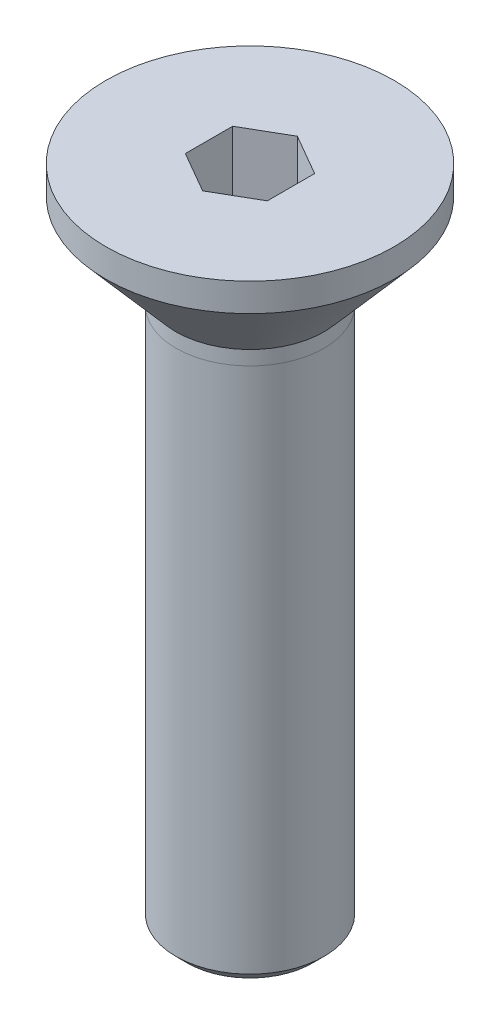
ISO-10303-21;
HEADER;
FILE_DESCRIPTION(('STEP AP214'),'2;1');
FILE_NAME('part.step','',(''),(''),'','','');
FILE_SCHEMA(('AUTOMOTIVE_DESIGN { 1 0 10303 214 1 1 1 1 }'));
ENDSEC;
DATA;
#1=APPLICATION_CONTEXT('core data for automotive mechanical design processes');
#2=APPLICATION_PROTOCOL_DEFINITION('international standard','automotive_design',2000,#1);
#3=PRODUCT_CONTEXT('',#1,'mechanical');
#4=PRODUCT('Part','Part','',(#3));
#5=PRODUCT_RELATED_PRODUCT_CATEGORY('part','',(#4));
#6=PRODUCT_DEFINITION_FORMATION('','',#4);
#7=PRODUCT_DEFINITION_CONTEXT('part definition',#1,'design');
#8=PRODUCT_DEFINITION('design','',#6,#7);
#9=PRODUCT_DEFINITION_SHAPE('','',#8);
#10=(LENGTH_UNIT() NAMED_UNIT(*) SI_UNIT(.MILLI.,.METRE.));
#11=(NAMED_UNIT(*) PLANE_ANGLE_UNIT() SI_UNIT($,.RADIAN.));
#12=(NAMED_UNIT(*) SI_UNIT($,.STERADIAN.) SOLID_ANGLE_UNIT());
#13=UNCERTAINTY_MEASURE_WITH_UNIT(LENGTH_MEASURE(1.E-05),#10,'distance_accuracy_value','');
#14=(GEOMETRIC_REPRESENTATION_CONTEXT(3) GLOBAL_UNCERTAINTY_ASSIGNED_CONTEXT((#13)) GLOBAL_UNIT_ASSIGNED_CONTEXT((#10,
#11,#12)) REPRESENTATION_CONTEXT('',''));
#15=CARTESIAN_POINT('',(0.,0.,0.));
#16=DIRECTION('',(0.,0.,1.));
#17=DIRECTION('',(1.,0.,0.));
#18=AXIS2_PLACEMENT_3D('',#15,#16,#17);
#19=CARTESIAN_POINT('',(0.,0.,0.));
#20=DIRECTION('',(0.,1.,0.));
#21=DIRECTION('',(0.,0.,1.));
#22=AXIS2_PLACEMENT_3D('',#19,#20,#21);
#23=CYLINDRICAL_SURFACE('',#22,1.42240000000001);
#24=CARTESIAN_POINT('',(0.,-2.08918406435412,0.));
#25=DIRECTION('',(0.,1.,0.));
#26=DIRECTION('',(0.,0.,1.));
#27=AXIS2_PLACEMENT_3D('',#24,#25,#26);
#28=CIRCLE('',#27,1.42240000000001);
#29=CARTESIAN_POINT('',(0.,-2.08918406435412,1.42240000000001));
#30=VERTEX_POINT('',#29);
#31=EDGE_CURVE('E148',#30,#30,#28,.T.);
#32=ORIENTED_EDGE('',*,*,#31,.F.);
#33=EDGE_LOOP('',(#32));
#34=FACE_BOUND('',#33,.T.);
#35=CARTESIAN_POINT('',(0.,-2.3622,0.));
#36=DIRECTION('',(0.,1.,0.));
#37=DIRECTION('',(0.,0.,1.));
#38=AXIS2_PLACEMENT_3D('',#35,#36,#37);
#39=CIRCLE('',#38,1.42240000000001);
#40=CARTESIAN_POINT('',(0.,-2.3622,1.42240000000001));
#41=VERTEX_POINT('',#40);
#42=EDGE_CURVE('E12',#41,#41,#39,.T.);
#43=ORIENTED_EDGE('',*,*,#42,.T.);
#44=EDGE_LOOP('',(#43));
#45=FACE_BOUND('',#44,.T.);
#46=ADVANCED_FACE('F35',(#34,#45),#23,.T.);
#47=CARTESIAN_POINT('',(0.,0.,0.));
#48=DIRECTION('',(0.,-1.,0.));
#49=DIRECTION('',(0.,0.,-1.));
#50=AXIS2_PLACEMENT_3D('',#47,#48,#49);
#51=PLANE('',#50);
#52=DIRECTION('',(-0.866025403784439,0.,0.5));
#53=VECTOR('',#52,1.);
#54=CARTESIAN_POINT('',(0.,0.,-0.909211203919823));
#55=LINE('',#54,#53);
#56=CARTESIAN_POINT('',(0.,0.,-0.909211203919823));
#57=VERTEX_POINT('',#56);
#58=CARTESIAN_POINT('',(-0.7874,0.,-0.454605601959912));
#59=VERTEX_POINT('',#58);
#60=EDGE_CURVE('E124',#57,#59,#55,.T.);
#61=ORIENTED_EDGE('',*,*,#60,.F.);
#62=DIRECTION('',(-0.866025403784438,0.,-0.5));
#63=VECTOR('',#62,1.);
#64=CARTESIAN_POINT('',(0.7874,0.,-0.454605601959911));
#65=LINE('',#64,#63);
#66=CARTESIAN_POINT('',(0.7874,0.,-0.454605601959911));
#67=VERTEX_POINT('',#66);
#68=EDGE_CURVE('E50',#67,#57,#65,.T.);
#69=ORIENTED_EDGE('',*,*,#68,.F.);
#70=DIRECTION('',(0.,0.,-1.));
#71=VECTOR('',#70,1.);
#72=CARTESIAN_POINT('',(0.7874,0.,0.454605601959912));
#73=LINE('',#72,#71);
#74=CARTESIAN_POINT('',(0.7874,0.,0.454605601959912));
#75=VERTEX_POINT('',#74);
#76=EDGE_CURVE('E133',#75,#67,#73,.T.);
#77=ORIENTED_EDGE('',*,*,#76,.F.);
#78=DIRECTION('',(0.866025403784439,0.,-0.5));
#79=VECTOR('',#78,1.);
#80=CARTESIAN_POINT('',(0.,0.,0.909211203919823));
#81=LINE('',#80,#79);
#82=CARTESIAN_POINT('',(0.,0.,0.909211203919823));
#83=VERTEX_POINT('',#82);
#84=EDGE_CURVE('E131',#83,#75,#81,.T.);
#85=ORIENTED_EDGE('',*,*,#84,.F.);
#86=DIRECTION('',(0.866025403784438,0.,0.5));
#87=VECTOR('',#86,1.);
#88=CARTESIAN_POINT('',(-0.7874,0.,0.454605601959911));
#89=LINE('',#88,#87);
#90=CARTESIAN_POINT('',(-0.7874,0.,0.454605601959911));
#91=VERTEX_POINT('',#90);
#92=EDGE_CURVE('E98',#91,#83,#89,.T.);
#93=ORIENTED_EDGE('',*,*,#92,.F.);
#94=DIRECTION('',(0.,0.,1.));
#95=VECTOR('',#94,1.);
#96=CARTESIAN_POINT('',(-0.7874,0.,-0.454605601959912));
#97=LINE('',#96,#95);
#98=EDGE_CURVE('E127',#59,#91,#97,.T.);
#99=ORIENTED_EDGE('',*,*,#98,.F.);
#100=EDGE_LOOP('',(#61,#69,#77,#85,#93,#99));
#101=FACE_BOUND('',#100,.T.);
#102=CARTESIAN_POINT('',(0.,0.,0.));
#103=DIRECTION('',(0.,1.,0.));
#104=DIRECTION('',(0.,0.,1.));
#105=AXIS2_PLACEMENT_3D('',#102,#103,#104);
#106=CIRCLE('',#105,2.7686);
#107=CARTESIAN_POINT('',(0.,0.,2.7686));
#108=VERTEX_POINT('',#107);
#109=EDGE_CURVE('E43',#108,#108,#106,.T.);
#110=ORIENTED_EDGE('',*,*,#109,.T.);
#111=EDGE_LOOP('',(#110));
#112=FACE_BOUND('',#111,.T.);
#113=ADVANCED_FACE('F37',(#101,#112),#51,.F.);
#114=CARTESIAN_POINT('',(0.,0.,0.));
#115=DIRECTION('',(0.,1.,0.));
#116=DIRECTION('',(0.,0.,1.));
#117=AXIS2_PLACEMENT_3D('',#114,#115,#116);
#118=CYLINDRICAL_SURFACE('',#117,2.7686);
#119=ORIENTED_EDGE('',*,*,#109,.F.);
#120=EDGE_LOOP('',(#119));
#121=FACE_BOUND('',#120,.T.);
#122=CARTESIAN_POINT('',(0.,-0.540558114553166,0.));
#123=DIRECTION('',(0.,1.,0.));
#124=DIRECTION('',(0.,0.,1.));
#125=AXIS2_PLACEMENT_3D('',#122,#123,#124);
#126=CIRCLE('',#125,2.7686);
#127=CARTESIAN_POINT('',(0.,-0.540558114553166,2.7686));
#128=VERTEX_POINT('',#127);
#129=EDGE_CURVE('E151',#128,#128,#126,.T.);
#130=ORIENTED_EDGE('',*,*,#129,.T.);
#131=EDGE_LOOP('',(#130));
#132=FACE_BOUND('',#131,.T.);
#133=ADVANCED_FACE('F157',(#121,#132),#118,.T.);
#134=CARTESIAN_POINT('',(0.,-2.08918406435412,0.));
#135=DIRECTION('',(0.,1.,0.));
#136=DIRECTION('',(0.,0.,1.));
#137=AXIS2_PLACEMENT_3D('',#134,#135,#136);
#138=CONICAL_SURFACE('',#137,1.42240000000001,0.715584993317663);
#139=ORIENTED_EDGE('',*,*,#129,.F.);
#140=EDGE_LOOP('',(#139));
#141=FACE_BOUND('',#140,.T.);
#142=ORIENTED_EDGE('',*,*,#31,.T.);
#143=EDGE_LOOP('',(#142));
#144=FACE_BOUND('',#143,.T.);
#145=ADVANCED_FACE('F160',(#141,#144),#138,.T.);
#146=ORIENTED_EDGE('',*,*,#42,.F.);
#147=EDGE_LOOP('',(#146));
#148=FACE_BOUND('',#147,.T.);
#149=CARTESIAN_POINT('',(0.,-12.4811692307692,0.));
#150=DIRECTION('',(0.,1.,0.));
#151=DIRECTION('',(0.,0.,1.));
#152=AXIS2_PLACEMENT_3D('',#149,#150,#151);
#153=CIRCLE('',#152,1.4224);
#154=CARTESIAN_POINT('',(0.,-12.4811692307692,1.4224));
#155=VERTEX_POINT('',#154);
#156=EDGE_CURVE('E145',#155,#155,#153,.T.);
#157=ORIENTED_EDGE('',*,*,#156,.T.);
#158=EDGE_LOOP('',(#157));
#159=FACE_BOUND('',#158,.T.);
#160=ADVANCED_FACE('F165',(#148,#159),#23,.T.);
#161=CARTESIAN_POINT('',(0.,-12.7,0.));
#162=DIRECTION('',(0.,1.,0.));
#163=DIRECTION('',(0.,0.,1.));
#164=AXIS2_PLACEMENT_3D('',#161,#162,#163);
#165=CONICAL_SURFACE('',#164,1.20356923076923,0.785398163397448);
#166=ORIENTED_EDGE('',*,*,#156,.F.);
#167=EDGE_LOOP('',(#166));
#168=FACE_BOUND('',#167,.T.);
#169=CARTESIAN_POINT('',(0.,-12.7,0.));
#170=DIRECTION('',(0.,1.,0.));
#171=DIRECTION('',(0.,0.,1.));
#172=AXIS2_PLACEMENT_3D('',#169,#170,#171);
#173=CIRCLE('',#172,1.20356923076923);
#174=CARTESIAN_POINT('',(0.,-12.7,1.20356923076923));
#175=VERTEX_POINT('',#174);
#176=EDGE_CURVE('E137',#175,#175,#173,.T.);
#177=ORIENTED_EDGE('',*,*,#176,.T.);
#178=EDGE_LOOP('',(#177));
#179=FACE_BOUND('',#178,.T.);
#180=ADVANCED_FACE('F176',(#168,#179),#165,.T.);
#181=CARTESIAN_POINT('',(0.,-12.7,0.));
#182=DIRECTION('',(0.,1.,0.));
#183=DIRECTION('',(0.,0.,1.));
#184=AXIS2_PLACEMENT_3D('',#181,#182,#183);
#185=PLANE('',#184);
#186=ORIENTED_EDGE('',*,*,#176,.F.);
#187=EDGE_LOOP('',(#186));
#188=FACE_BOUND('',#187,.T.);
#189=ADVANCED_FACE('F181',(#188),#185,.F.);
#190=CARTESIAN_POINT('',(0.7874,-1.397,-0.454605601959911));
#191=DIRECTION('',(0.5,0.,-0.866025403784438));
#192=DIRECTION('',(-0.866025403784438,0.,-0.5));
#193=AXIS2_PLACEMENT_3D('',#190,#191,#192);
#194=PLANE('',#193);
#195=ORIENTED_EDGE('',*,*,#68,.T.);
#196=DIRECTION('',(0.,1.,0.));
#197=VECTOR('',#196,1.);
#198=CARTESIAN_POINT('',(0.,-1.397,-0.909211203919823));
#199=LINE('',#198,#197);
#200=CARTESIAN_POINT('',(0.,-1.397,-0.909211203919823));
#201=VERTEX_POINT('',#200);
#202=EDGE_CURVE('E80',#201,#57,#199,.T.);
#203=ORIENTED_EDGE('',*,*,#202,.F.);
#204=DIRECTION('',(-0.866025403784438,0.,-0.5));
#205=VECTOR('',#204,1.);
#206=CARTESIAN_POINT('',(0.7874,-1.397,-0.454605601959911));
#207=LINE('',#206,#205);
#208=CARTESIAN_POINT('',(0.7874,-1.397,-0.454605601959911));
#209=VERTEX_POINT('',#208);
#210=EDGE_CURVE('E135',#209,#201,#207,.T.);
#211=ORIENTED_EDGE('',*,*,#210,.F.);
#212=DIRECTION('',(0.,1.,0.));
#213=VECTOR('',#212,1.);
#214=CARTESIAN_POINT('',(0.7874,-1.397,-0.454605601959911));
#215=LINE('',#214,#213);
#216=EDGE_CURVE('E58',#209,#67,#215,.T.);
#217=ORIENTED_EDGE('',*,*,#216,.T.);
#218=EDGE_LOOP('',(#195,#203,#211,#217));
#219=FACE_BOUND('',#218,.T.);
#220=ADVANCED_FACE('F186',(#219),#194,.F.);
#221=CARTESIAN_POINT('',(0.7874,-1.397,0.454605601959912));
#222=DIRECTION('',(1.,0.,0.));
#223=DIRECTION('',(0.,0.,-1.));
#224=AXIS2_PLACEMENT_3D('',#221,#222,#223);
#225=PLANE('',#224);
#226=ORIENTED_EDGE('',*,*,#76,.T.);
#227=ORIENTED_EDGE('',*,*,#216,.F.);
#228=DIRECTION('',(0.,0.,-1.));
#229=VECTOR('',#228,1.);
#230=CARTESIAN_POINT('',(0.7874,-1.397,0.454605601959912));
#231=LINE('',#230,#229);
#232=CARTESIAN_POINT('',(0.7874,-1.397,0.454605601959912));
#233=VERTEX_POINT('',#232);
#234=EDGE_CURVE('E110',#233,#209,#231,.T.);
#235=ORIENTED_EDGE('',*,*,#234,.F.);
#236=DIRECTION('',(0.,1.,0.));
#237=VECTOR('',#236,1.);
#238=CARTESIAN_POINT('',(0.7874,-1.397,0.454605601959912));
#239=LINE('',#238,#237);
#240=EDGE_CURVE('E102',#233,#75,#239,.T.);
#241=ORIENTED_EDGE('',*,*,#240,.T.);
#242=EDGE_LOOP('',(#226,#227,#235,#241));
#243=FACE_BOUND('',#242,.T.);
#244=ADVANCED_FACE('F191',(#243),#225,.F.);
#245=CARTESIAN_POINT('',(0.,-1.397,0.909211203919823));
#246=DIRECTION('',(0.5,0.,0.866025403784439));
#247=DIRECTION('',(0.866025403784439,0.,-0.5));
#248=AXIS2_PLACEMENT_3D('',#245,#246,#247);
#249=PLANE('',#248);
#250=ORIENTED_EDGE('',*,*,#84,.T.);
#251=ORIENTED_EDGE('',*,*,#240,.F.);
#252=DIRECTION('',(0.866025403784439,0.,-0.5));
#253=VECTOR('',#252,1.);
#254=CARTESIAN_POINT('',(0.,-1.397,0.909211203919823));
#255=LINE('',#254,#253);
#256=CARTESIAN_POINT('',(0.,-1.397,0.909211203919823));
#257=VERTEX_POINT('',#256);
#258=EDGE_CURVE('E106',#257,#233,#255,.T.);
#259=ORIENTED_EDGE('',*,*,#258,.F.);
#260=DIRECTION('',(0.,1.,0.));
#261=VECTOR('',#260,1.);
#262=CARTESIAN_POINT('',(0.,-1.397,0.909211203919823));
#263=LINE('',#262,#261);
#264=EDGE_CURVE('E91',#257,#83,#263,.T.);
#265=ORIENTED_EDGE('',*,*,#264,.T.);
#266=EDGE_LOOP('',(#250,#251,#259,#265));
#267=FACE_BOUND('',#266,.T.);
#268=ADVANCED_FACE('F107',(#267),#249,.F.);
#269=CARTESIAN_POINT('',(-0.7874,-1.397,0.454605601959911));
#270=DIRECTION('',(-0.5,0.,0.866025403784438));
#271=DIRECTION('',(0.866025403784438,0.,0.5));
#272=AXIS2_PLACEMENT_3D('',#269,#270,#271);
#273=PLANE('',#272);
#274=ORIENTED_EDGE('',*,*,#92,.T.);
#275=ORIENTED_EDGE('',*,*,#264,.F.);
#276=DIRECTION('',(0.866025403784438,0.,0.5));
#277=VECTOR('',#276,1.);
#278=CARTESIAN_POINT('',(-0.7874,-1.397,0.454605601959911));
#279=LINE('',#278,#277);
#280=CARTESIAN_POINT('',(-0.7874,-1.397,0.454605601959911));
#281=VERTEX_POINT('',#280);
#282=EDGE_CURVE('E95',#281,#257,#279,.T.);
#283=ORIENTED_EDGE('',*,*,#282,.F.);
#284=DIRECTION('',(0.,1.,0.));
#285=VECTOR('',#284,1.);
#286=CARTESIAN_POINT('',(-0.7874,-1.397,0.454605601959911));
#287=LINE('',#286,#285);
#288=EDGE_CURVE('E103',#281,#91,#287,.T.);
#289=ORIENTED_EDGE('',*,*,#288,.T.);
#290=EDGE_LOOP('',(#274,#275,#283,#289));
#291=FACE_BOUND('',#290,.T.);
#292=ADVANCED_FACE('F93',(#291),#273,.F.);
#293=CARTESIAN_POINT('',(-0.7874,-1.397,-0.454605601959912));
#294=DIRECTION('',(-1.,0.,0.));
#295=DIRECTION('',(0.,0.,1.));
#296=AXIS2_PLACEMENT_3D('',#293,#294,#295);
#297=PLANE('',#296);
#298=ORIENTED_EDGE('',*,*,#98,.T.);
#299=ORIENTED_EDGE('',*,*,#288,.F.);
#300=DIRECTION('',(0.,0.,1.));
#301=VECTOR('',#300,1.);
#302=CARTESIAN_POINT('',(-0.7874,-1.397,-0.454605601959912));
#303=LINE('',#302,#301);
#304=CARTESIAN_POINT('',(-0.7874,-1.397,-0.454605601959912));
#305=VERTEX_POINT('',#304);
#306=EDGE_CURVE('E116',#305,#281,#303,.T.);
#307=ORIENTED_EDGE('',*,*,#306,.F.);
#308=DIRECTION('',(0.,1.,0.));
#309=VECTOR('',#308,1.);
#310=CARTESIAN_POINT('',(-0.7874,-1.397,-0.454605601959912));
#311=LINE('',#310,#309);
#312=EDGE_CURVE('E140',#305,#59,#311,.T.);
#313=ORIENTED_EDGE('',*,*,#312,.T.);
#314=EDGE_LOOP('',(#298,#299,#307,#313));
#315=FACE_BOUND('',#314,.T.);
#316=ADVANCED_FACE('F197',(#315),#297,.F.);
#317=CARTESIAN_POINT('',(0.,-1.397,-0.909211203919823));
#318=DIRECTION('',(-0.5,0.,-0.866025403784439));
#319=DIRECTION('',(-0.866025403784439,0.,0.5));
#320=AXIS2_PLACEMENT_3D('',#317,#318,#319);
#321=PLANE('',#320);
#322=ORIENTED_EDGE('',*,*,#60,.T.);
#323=ORIENTED_EDGE('',*,*,#312,.F.);
#324=DIRECTION('',(-0.866025403784439,0.,0.5));
#325=VECTOR('',#324,1.);
#326=CARTESIAN_POINT('',(0.,-1.397,-0.909211203919823));
#327=LINE('',#326,#325);
#328=EDGE_CURVE('E118',#201,#305,#327,.T.);
#329=ORIENTED_EDGE('',*,*,#328,.F.);
#330=ORIENTED_EDGE('',*,*,#202,.T.);
#331=EDGE_LOOP('',(#322,#323,#329,#330));
#332=FACE_BOUND('',#331,.T.);
#333=ADVANCED_FACE('F194',(#332),#321,.F.);
#334=CARTESIAN_POINT('',(0.,-1.397,-0.909211203919823));
#335=DIRECTION('',(0.,1.,0.));
#336=DIRECTION('',(0.,0.,1.));
#337=AXIS2_PLACEMENT_3D('',#334,#335,#336);
#338=PLANE('',#337);
#339=ORIENTED_EDGE('',*,*,#210,.T.);
#340=ORIENTED_EDGE('',*,*,#328,.T.);
#341=ORIENTED_EDGE('',*,*,#306,.T.);
#342=ORIENTED_EDGE('',*,*,#282,.T.);
#343=ORIENTED_EDGE('',*,*,#258,.T.);
#344=ORIENTED_EDGE('',*,*,#234,.T.);
#345=EDGE_LOOP('',(#339,#340,#341,#342,#343,#344));
#346=FACE_BOUND('',#345,.T.);
#347=ADVANCED_FACE('F113',(#346),#338,.T.);
#348=CLOSED_SHELL('',(#46,#113,#133,#145,#160,#180,#189,#220,#244,#268,#292,#316,#333,#347));
#349=MANIFOLD_SOLID_BREP('B2',#348);
#350=ADVANCED_BREP_SHAPE_REPRESENTATION('',(#18,#349),#14);
#351=SHAPE_DEFINITION_REPRESENTATION(#9,#350);
ENDSEC;
END-ISO-10303-21;
